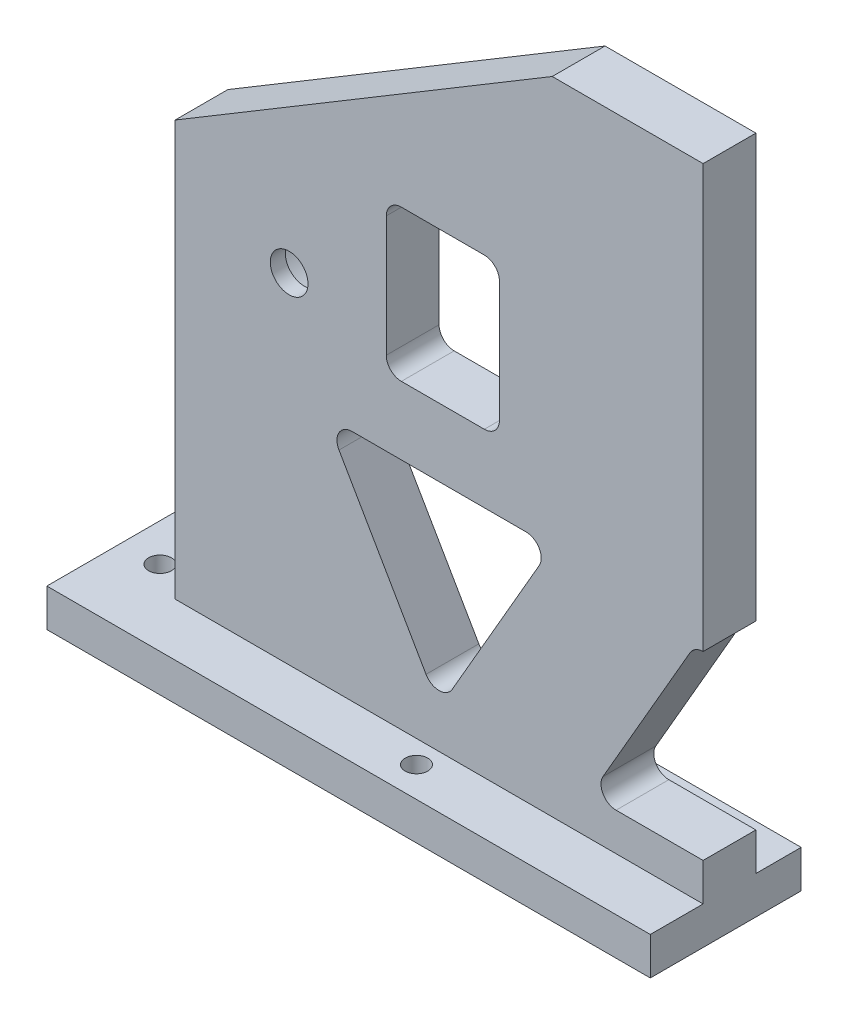
ISO-10303-21;
HEADER;
FILE_DESCRIPTION(('STEP AP214'),'2;1');
FILE_NAME('part.step','',(''),(''),'','','');
FILE_SCHEMA(('AUTOMOTIVE_DESIGN { 1 0 10303 214 1 1 1 1 }'));
ENDSEC;
DATA;
#1=APPLICATION_CONTEXT('core data for automotive mechanical design processes');
#2=APPLICATION_PROTOCOL_DEFINITION('international standard','automotive_design',2000,#1);
#3=PRODUCT_CONTEXT('',#1,'mechanical');
#4=PRODUCT('Part','Part','',(#3));
#5=PRODUCT_RELATED_PRODUCT_CATEGORY('part','',(#4));
#6=PRODUCT_DEFINITION_FORMATION('','',#4);
#7=PRODUCT_DEFINITION_CONTEXT('part definition',#1,'design');
#8=PRODUCT_DEFINITION('design','',#6,#7);
#9=PRODUCT_DEFINITION_SHAPE('','',#8);
#10=(LENGTH_UNIT() NAMED_UNIT(*) SI_UNIT(.MILLI.,.METRE.));
#11=(NAMED_UNIT(*) PLANE_ANGLE_UNIT() SI_UNIT($,.RADIAN.));
#12=(NAMED_UNIT(*) SI_UNIT($,.STERADIAN.) SOLID_ANGLE_UNIT());
#13=UNCERTAINTY_MEASURE_WITH_UNIT(LENGTH_MEASURE(1.E-05),#10,'distance_accuracy_value','');
#14=(GEOMETRIC_REPRESENTATION_CONTEXT(3) GLOBAL_UNCERTAINTY_ASSIGNED_CONTEXT((#13)) GLOBAL_UNIT_ASSIGNED_CONTEXT((#10,
#11,#12)) REPRESENTATION_CONTEXT('',''));
#15=CARTESIAN_POINT('',(0.,0.,0.));
#16=DIRECTION('',(0.,0.,1.));
#17=DIRECTION('',(1.,0.,0.));
#18=AXIS2_PLACEMENT_3D('',#15,#16,#17);
#19=CARTESIAN_POINT('',(70.,0.,0.));
#20=DIRECTION('',(-1.,0.,0.));
#21=DIRECTION('',(0.,-1.,0.));
#22=AXIS2_PLACEMENT_3D('',#19,#20,#21);
#23=PLANE('',#22);
#24=DIRECTION('',(0.,1.,0.));
#25=VECTOR('',#24,1.);
#26=CARTESIAN_POINT('',(70.,5.00000000000005,-6.00000000000002));
#27=LINE('',#26,#25);
#28=CARTESIAN_POINT('',(70.,0.,-6.00000000000002));
#29=VERTEX_POINT('',#28);
#30=CARTESIAN_POINT('',(70.,5.,-6.00000000000002));
#31=VERTEX_POINT('',#30);
#32=EDGE_CURVE('E11',#29,#31,#27,.T.);
#33=ORIENTED_EDGE('',*,*,#32,.T.);
#34=DIRECTION('',(0.,0.,-1.));
#35=VECTOR('',#34,1.);
#36=CARTESIAN_POINT('',(70.,5.,0.));
#37=LINE('',#36,#35);
#38=CARTESIAN_POINT('',(70.,5.,0.));
#39=VERTEX_POINT('',#38);
#40=EDGE_CURVE('E405',#39,#31,#37,.T.);
#41=ORIENTED_EDGE('',*,*,#40,.F.);
#42=DIRECTION('',(0.,-1.,0.));
#43=VECTOR('',#42,1.);
#44=CARTESIAN_POINT('',(70.,0.,0.));
#45=LINE('',#44,#43);
#46=CARTESIAN_POINT('',(70.,10.,0.));
#47=VERTEX_POINT('',#46);
#48=EDGE_CURVE('E398',#47,#39,#45,.T.);
#49=ORIENTED_EDGE('',*,*,#48,.F.);
#50=DIRECTION('',(0.,0.,-1.));
#51=VECTOR('',#50,1.);
#52=CARTESIAN_POINT('',(70.,10.,-6.00100000000002));
#53=LINE('',#52,#51);
#54=CARTESIAN_POINT('',(70.,10.,7.));
#55=VERTEX_POINT('',#54);
#56=EDGE_CURVE('E394',#55,#47,#53,.T.);
#57=ORIENTED_EDGE('',*,*,#56,.F.);
#58=DIRECTION('',(0.,-1.,0.));
#59=VECTOR('',#58,1.);
#60=CARTESIAN_POINT('',(70.,0.,7.));
#61=LINE('',#60,#59);
#62=CARTESIAN_POINT('',(70.,5.,7.));
#63=VERTEX_POINT('',#62);
#64=EDGE_CURVE('E399',#55,#63,#61,.T.);
#65=ORIENTED_EDGE('',*,*,#64,.T.);
#66=CARTESIAN_POINT('',(70.,5.,14.));
#67=VERTEX_POINT('',#66);
#68=EDGE_CURVE('E403',#67,#63,#37,.T.);
#69=ORIENTED_EDGE('',*,*,#68,.F.);
#70=DIRECTION('',(0.,-1.,0.));
#71=VECTOR('',#70,1.);
#72=CARTESIAN_POINT('',(70.,4.99999999999996,14.));
#73=LINE('',#72,#71);
#74=CARTESIAN_POINT('',(70.,0.,14.));
#75=VERTEX_POINT('',#74);
#76=EDGE_CURVE('E51',#67,#75,#73,.T.);
#77=ORIENTED_EDGE('',*,*,#76,.T.);
#78=DIRECTION('',(0.,0.,1.));
#79=VECTOR('',#78,1.);
#80=CARTESIAN_POINT('',(70.,0.,7.));
#81=LINE('',#80,#79);
#82=EDGE_CURVE('E46',#29,#75,#81,.T.);
#83=ORIENTED_EDGE('',*,*,#82,.F.);
#84=EDGE_LOOP('',(#33,#41,#49,#57,#65,#69,#77,#83));
#85=FACE_BOUND('',#84,.T.);
#86=ADVANCED_FACE('F43',(#85),#23,.F.);
#87=CARTESIAN_POINT('',(70.,90.,7.));
#88=VERTEX_POINT('',#87);
#89=CARTESIAN_POINT('',(70.,33.9807621135332,7.));
#90=VERTEX_POINT('',#89);
#91=EDGE_CURVE('E397',#88,#90,#61,.T.);
#92=ORIENTED_EDGE('',*,*,#91,.T.);
#93=DIRECTION('',(0.,0.,-1.));
#94=VECTOR('',#93,1.);
#95=CARTESIAN_POINT('',(70.,33.9807621135332,-6.00100000000002));
#96=LINE('',#95,#94);
#97=CARTESIAN_POINT('',(70.,33.9807621135332,0.));
#98=VERTEX_POINT('',#97);
#99=EDGE_CURVE('E392',#98,#90,#96,.F.);
#100=ORIENTED_EDGE('',*,*,#99,.F.);
#101=CARTESIAN_POINT('',(70.,90.,0.));
#102=VERTEX_POINT('',#101);
#103=EDGE_CURVE('E395',#102,#98,#45,.T.);
#104=ORIENTED_EDGE('',*,*,#103,.F.);
#105=DIRECTION('',(0.,0.,-1.));
#106=VECTOR('',#105,1.);
#107=CARTESIAN_POINT('',(70.,90.,7.));
#108=LINE('',#107,#106);
#109=EDGE_CURVE('E59',#88,#102,#108,.T.);
#110=ORIENTED_EDGE('',*,*,#109,.F.);
#111=EDGE_LOOP('',(#92,#100,#104,#110));
#112=FACE_BOUND('',#111,.T.);
#113=ADVANCED_FACE('F429',(#112),#23,.F.);
#114=CARTESIAN_POINT('',(15.1207990870121,49.999999999998,5.));
#115=DIRECTION('',(0.,0.,1.));
#116=DIRECTION('',(1.,0.,0.));
#117=AXIS2_PLACEMENT_3D('',#114,#115,#116);
#118=PLANE('',#117);
#119=CARTESIAN_POINT('',(15.1207990870121,49.999999999998,5.));
#120=DIRECTION('',(0.,0.,1.));
#121=DIRECTION('',(1.,0.,0.));
#122=AXIS2_PLACEMENT_3D('',#119,#120,#121);
#123=CIRCLE('',#122,7.);
#124=CARTESIAN_POINT('',(22.1207990870121,49.999999999998,5.));
#125=VERTEX_POINT('',#124);
#126=EDGE_CURVE('E274',#125,#125,#123,.T.);
#127=ORIENTED_EDGE('',*,*,#126,.F.);
#128=EDGE_LOOP('',(#127));
#129=FACE_BOUND('',#128,.T.);
#130=CARTESIAN_POINT('',(15.1207990870121,49.999999999998,5.));
#131=DIRECTION('',(0.,0.,1.));
#132=DIRECTION('',(1.,0.,0.));
#133=AXIS2_PLACEMENT_3D('',#130,#131,#132);
#134=CIRCLE('',#133,2.5);
#135=CARTESIAN_POINT('',(17.6207990870121,49.999999999998,5.));
#136=VERTEX_POINT('',#135);
#137=EDGE_CURVE('E273',#136,#136,#134,.F.);
#138=ORIENTED_EDGE('',*,*,#137,.F.);
#139=EDGE_LOOP('',(#138));
#140=FACE_BOUND('',#139,.T.);
#141=ADVANCED_FACE('F433',(#129,#140),#118,.F.);
#142=CARTESIAN_POINT('',(55.9129551957541,59.9999999999994,5.));
#143=DIRECTION('',(0.,0.,1.));
#144=DIRECTION('',(1.,0.,0.));
#145=AXIS2_PLACEMENT_3D('',#142,#143,#144);
#146=PLANE('',#145);
#147=CARTESIAN_POINT('',(55.9129551957541,59.9999999999994,5.));
#148=DIRECTION('',(0.,0.,1.));
#149=DIRECTION('',(1.,0.,0.));
#150=AXIS2_PLACEMENT_3D('',#147,#148,#149);
#151=CIRCLE('',#150,6.99999999999999);
#152=CARTESIAN_POINT('',(62.9129551957541,59.9999999999994,5.));
#153=VERTEX_POINT('',#152);
#154=EDGE_CURVE('E277',#153,#153,#151,.T.);
#155=ORIENTED_EDGE('',*,*,#154,.F.);
#156=EDGE_LOOP('',(#155));
#157=FACE_BOUND('',#156,.T.);
#158=ADVANCED_FACE('F438',(#157),#146,.F.);
#159=CARTESIAN_POINT('',(15.1207990870121,49.999999999998,0.));
#160=DIRECTION('',(0.,0.,-1.));
#161=DIRECTION('',(-1.,0.,0.));
#162=AXIS2_PLACEMENT_3D('',#159,#160,#161);
#163=CYLINDRICAL_SURFACE('',#162,2.5);
#164=ORIENTED_EDGE('',*,*,#137,.T.);
#165=EDGE_LOOP('',(#164));
#166=FACE_BOUND('',#165,.T.);
#167=CARTESIAN_POINT('',(15.1207990870121,49.999999999998,7.));
#168=DIRECTION('',(0.,0.,-1.));
#169=DIRECTION('',(-1.,0.,0.));
#170=AXIS2_PLACEMENT_3D('',#167,#168,#169);
#171=CIRCLE('',#170,2.5);
#172=CARTESIAN_POINT('',(12.6207990870121,49.999999999998,7.));
#173=VERTEX_POINT('',#172);
#174=EDGE_CURVE('E282',#173,#173,#171,.T.);
#175=ORIENTED_EDGE('',*,*,#174,.F.);
#176=EDGE_LOOP('',(#175));
#177=FACE_BOUND('',#176,.T.);
#178=ADVANCED_FACE('F665',(#166,#177),#163,.F.);
#179=CARTESIAN_POINT('',(15.1207990870121,49.999999999998,0.));
#180=DIRECTION('',(0.,0.,1.));
#181=DIRECTION('',(1.,0.,0.));
#182=AXIS2_PLACEMENT_3D('',#179,#180,#181);
#183=CYLINDRICAL_SURFACE('',#182,7.);
#184=CARTESIAN_POINT('',(15.1207990870121,49.999999999998,0.));
#185=DIRECTION('',(0.,0.,1.));
#186=DIRECTION('',(1.,0.,0.));
#187=AXIS2_PLACEMENT_3D('',#184,#185,#186);
#188=CIRCLE('',#187,7.);
#189=CARTESIAN_POINT('',(22.1207990870121,49.999999999998,0.));
#190=VERTEX_POINT('',#189);
#191=EDGE_CURVE('E270',#190,#190,#188,.T.);
#192=ORIENTED_EDGE('',*,*,#191,.F.);
#193=EDGE_LOOP('',(#192));
#194=FACE_BOUND('',#193,.T.);
#195=ORIENTED_EDGE('',*,*,#126,.T.);
#196=EDGE_LOOP('',(#195));
#197=FACE_BOUND('',#196,.T.);
#198=ADVANCED_FACE('F662',(#194,#197),#183,.F.);
#199=CARTESIAN_POINT('',(55.9129551957541,59.9999999999994,0.));
#200=DIRECTION('',(0.,0.,1.));
#201=DIRECTION('',(1.,0.,0.));
#202=AXIS2_PLACEMENT_3D('',#199,#200,#201);
#203=CYLINDRICAL_SURFACE('',#202,6.99999999999999);
#204=CARTESIAN_POINT('',(55.9129551957541,59.9999999999994,0.));
#205=DIRECTION('',(0.,0.,1.));
#206=DIRECTION('',(1.,0.,0.));
#207=AXIS2_PLACEMENT_3D('',#204,#205,#206);
#208=CIRCLE('',#207,6.99999999999999);
#209=CARTESIAN_POINT('',(62.9129551957541,59.9999999999994,0.));
#210=VERTEX_POINT('',#209);
#211=EDGE_CURVE('E269',#210,#210,#208,.T.);
#212=ORIENTED_EDGE('',*,*,#211,.F.);
#213=EDGE_LOOP('',(#212));
#214=FACE_BOUND('',#213,.T.);
#215=ORIENTED_EDGE('',*,*,#154,.T.);
#216=EDGE_LOOP('',(#215));
#217=FACE_BOUND('',#216,.T.);
#218=ADVANCED_FACE('F487',(#214,#217),#203,.F.);
#219=CARTESIAN_POINT('',(46.5358983848622,33.9807621135331,-6.00100000000002));
#220=DIRECTION('',(0.,0.,-1.));
#221=DIRECTION('',(-1.,0.,0.));
#222=AXIS2_PLACEMENT_3D('',#219,#220,#221);
#223=CYLINDRICAL_SURFACE('',#222,2.);
#224=CARTESIAN_POINT('',(46.5358983848622,33.9807621135331,0.));
#225=DIRECTION('',(0.,0.,1.));
#226=DIRECTION('',(1.,0.,0.));
#227=AXIS2_PLACEMENT_3D('',#224,#225,#226);
#228=CIRCLE('',#227,2.);
#229=CARTESIAN_POINT('',(48.2679491924311,32.9807621135331,0.));
#230=VERTEX_POINT('',#229);
#231=CARTESIAN_POINT('',(46.5358983848622,35.9807621135331,0.));
#232=VERTEX_POINT('',#231);
#233=EDGE_CURVE('E350',#230,#232,#228,.T.);
#234=ORIENTED_EDGE('',*,*,#233,.F.);
#235=DIRECTION('',(0.,0.,1.));
#236=VECTOR('',#235,1.);
#237=CARTESIAN_POINT('',(48.2679491924311,32.9807621135331,0.));
#238=LINE('',#237,#236);
#239=CARTESIAN_POINT('',(48.2679491924311,32.9807621135331,7.));
#240=VERTEX_POINT('',#239);
#241=EDGE_CURVE('E332',#240,#230,#238,.F.);
#242=ORIENTED_EDGE('',*,*,#241,.F.);
#243=CARTESIAN_POINT('',(46.5358983848622,33.9807621135331,7.));
#244=DIRECTION('',(0.,0.,1.));
#245=DIRECTION('',(1.,0.,0.));
#246=AXIS2_PLACEMENT_3D('',#243,#244,#245);
#247=CIRCLE('',#246,2.);
#248=CARTESIAN_POINT('',(46.5358983848622,35.9807621135331,7.));
#249=VERTEX_POINT('',#248);
#250=EDGE_CURVE('E348',#249,#240,#247,.F.);
#251=ORIENTED_EDGE('',*,*,#250,.F.);
#252=DIRECTION('',(0.,0.,1.));
#253=VECTOR('',#252,1.);
#254=CARTESIAN_POINT('',(46.5358983848622,35.9807621135331,7.));
#255=LINE('',#254,#253);
#256=EDGE_CURVE('E324',#232,#249,#255,.T.);
#257=ORIENTED_EDGE('',*,*,#256,.F.);
#258=EDGE_LOOP('',(#234,#242,#251,#257));
#259=FACE_BOUND('',#258,.T.);
#260=ADVANCED_FACE('F483',(#259),#223,.F.);
#261=CARTESIAN_POINT('',(50.,35.9807621135331,-6.00100000000002));
#262=DIRECTION('',(0.866025403784438,-0.5,0.));
#263=DIRECTION('',(0.5,0.866025403784439,0.));
#264=AXIS2_PLACEMENT_3D('',#261,#262,#263);
#265=PLANE('',#264);
#266=DIRECTION('',(0.5,0.866025403784438,0.));
#267=VECTOR('',#266,1.);
#268=CARTESIAN_POINT('',(50.,35.9807621135331,7.));
#269=LINE('',#268,#267);
#270=CARTESIAN_POINT('',(36.7320508075689,13.,7.));
#271=VERTEX_POINT('',#270);
#272=EDGE_CURVE('E554',#271,#240,#269,.T.);
#273=ORIENTED_EDGE('',*,*,#272,.T.);
#274=ORIENTED_EDGE('',*,*,#241,.T.);
#275=DIRECTION('',(-0.5,-0.866025403784439,0.));
#276=VECTOR('',#275,1.);
#277=CARTESIAN_POINT('',(50.,35.9807621135331,0.));
#278=LINE('',#277,#276);
#279=CARTESIAN_POINT('',(36.7320508075689,13.,0.));
#280=VERTEX_POINT('',#279);
#281=EDGE_CURVE('E548',#230,#280,#278,.T.);
#282=ORIENTED_EDGE('',*,*,#281,.T.);
#283=DIRECTION('',(0.,0.,1.));
#284=VECTOR('',#283,1.);
#285=CARTESIAN_POINT('',(36.7320508075689,13.,7.));
#286=LINE('',#285,#284);
#287=EDGE_CURVE('E329',#280,#271,#286,.T.);
#288=ORIENTED_EDGE('',*,*,#287,.T.);
#289=EDGE_LOOP('',(#273,#274,#282,#288));
#290=FACE_BOUND('',#289,.T.);
#291=ADVANCED_FACE('F486',(#290),#265,.F.);
#292=CARTESIAN_POINT('',(35.,14.,-6.00100000000002));
#293=DIRECTION('',(0.,0.,-1.));
#294=DIRECTION('',(-1.,0.,0.));
#295=AXIS2_PLACEMENT_3D('',#292,#293,#294);
#296=CYLINDRICAL_SURFACE('',#295,2.);
#297=CARTESIAN_POINT('',(35.,14.,0.));
#298=DIRECTION('',(0.,0.,1.));
#299=DIRECTION('',(1.,0.,0.));
#300=AXIS2_PLACEMENT_3D('',#297,#298,#299);
#301=CIRCLE('',#300,2.);
#302=CARTESIAN_POINT('',(33.2679491924311,13.,0.));
#303=VERTEX_POINT('',#302);
#304=EDGE_CURVE('E354',#303,#280,#301,.T.);
#305=ORIENTED_EDGE('',*,*,#304,.F.);
#306=DIRECTION('',(0.,0.,1.));
#307=VECTOR('',#306,1.);
#308=CARTESIAN_POINT('',(33.2679491924311,13.,0.));
#309=LINE('',#308,#307);
#310=CARTESIAN_POINT('',(33.2679491924311,13.,7.));
#311=VERTEX_POINT('',#310);
#312=EDGE_CURVE('E319',#311,#303,#309,.F.);
#313=ORIENTED_EDGE('',*,*,#312,.F.);
#314=CARTESIAN_POINT('',(35.,14.,7.));
#315=DIRECTION('',(0.,0.,1.));
#316=DIRECTION('',(1.,0.,0.));
#317=AXIS2_PLACEMENT_3D('',#314,#315,#316);
#318=CIRCLE('',#317,2.);
#319=EDGE_CURVE('E352',#271,#311,#318,.F.);
#320=ORIENTED_EDGE('',*,*,#319,.F.);
#321=ORIENTED_EDGE('',*,*,#287,.F.);
#322=EDGE_LOOP('',(#305,#313,#320,#321));
#323=FACE_BOUND('',#322,.T.);
#324=ADVANCED_FACE('F489',(#323),#296,.F.);
#325=CARTESIAN_POINT('',(35.,10.,-6.00100000000002));
#326=DIRECTION('',(-0.866025403784439,-0.5,0.));
#327=DIRECTION('',(0.5,-0.866025403784439,0.));
#328=AXIS2_PLACEMENT_3D('',#325,#326,#327);
#329=PLANE('',#328);
#330=DIRECTION('',(-0.5,0.866025403784439,0.));
#331=VECTOR('',#330,1.);
#332=CARTESIAN_POINT('',(35.,10.,0.));
#333=LINE('',#332,#331);
#334=CARTESIAN_POINT('',(21.7320508075689,32.9807621135332,0.));
#335=VERTEX_POINT('',#334);
#336=EDGE_CURVE('E560',#303,#335,#333,.T.);
#337=ORIENTED_EDGE('',*,*,#336,.T.);
#338=DIRECTION('',(0.,0.,1.));
#339=VECTOR('',#338,1.);
#340=CARTESIAN_POINT('',(21.7320508075689,32.9807621135332,7.));
#341=LINE('',#340,#339);
#342=CARTESIAN_POINT('',(21.7320508075689,32.9807621135332,7.));
#343=VERTEX_POINT('',#342);
#344=EDGE_CURVE('E321',#335,#343,#341,.T.);
#345=ORIENTED_EDGE('',*,*,#344,.T.);
#346=DIRECTION('',(0.5,-0.866025403784439,0.));
#347=VECTOR('',#346,1.);
#348=CARTESIAN_POINT('',(35.,10.,7.));
#349=LINE('',#348,#347);
#350=EDGE_CURVE('E557',#343,#311,#349,.T.);
#351=ORIENTED_EDGE('',*,*,#350,.T.);
#352=ORIENTED_EDGE('',*,*,#312,.T.);
#353=EDGE_LOOP('',(#337,#345,#351,#352));
#354=FACE_BOUND('',#353,.T.);
#355=ADVANCED_FACE('F481',(#354),#329,.F.);
#356=CARTESIAN_POINT('',(23.4641016151378,33.9807621135332,-6.00100000000002));
#357=DIRECTION('',(0.,0.,-1.));
#358=DIRECTION('',(-1.,0.,0.));
#359=AXIS2_PLACEMENT_3D('',#356,#357,#358);
#360=CYLINDRICAL_SURFACE('',#359,2.);
#361=CARTESIAN_POINT('',(23.4641016151378,33.9807621135332,0.));
#362=DIRECTION('',(0.,0.,1.));
#363=DIRECTION('',(1.,0.,0.));
#364=AXIS2_PLACEMENT_3D('',#361,#362,#363);
#365=CIRCLE('',#364,2.);
#366=CARTESIAN_POINT('',(23.4641016151378,35.9807621135332,0.));
#367=VERTEX_POINT('',#366);
#368=EDGE_CURVE('E346',#367,#335,#365,.T.);
#369=ORIENTED_EDGE('',*,*,#368,.F.);
#370=DIRECTION('',(0.,0.,1.));
#371=VECTOR('',#370,1.);
#372=CARTESIAN_POINT('',(23.4641016151378,35.9807621135332,0.));
#373=LINE('',#372,#371);
#374=CARTESIAN_POINT('',(23.4641016151378,35.9807621135332,7.));
#375=VERTEX_POINT('',#374);
#376=EDGE_CURVE('E327',#375,#367,#373,.F.);
#377=ORIENTED_EDGE('',*,*,#376,.F.);
#378=CARTESIAN_POINT('',(23.4641016151378,33.9807621135332,7.));
#379=DIRECTION('',(0.,0.,1.));
#380=DIRECTION('',(1.,0.,0.));
#381=AXIS2_PLACEMENT_3D('',#378,#379,#380);
#382=CIRCLE('',#381,2.);
#383=EDGE_CURVE('E344',#343,#375,#382,.F.);
#384=ORIENTED_EDGE('',*,*,#383,.F.);
#385=ORIENTED_EDGE('',*,*,#344,.F.);
#386=EDGE_LOOP('',(#369,#377,#384,#385));
#387=FACE_BOUND('',#386,.T.);
#388=ADVANCED_FACE('F477',(#387),#360,.F.);
#389=CARTESIAN_POINT('',(20.,35.9807621135332,-6.00100000000002));
#390=DIRECTION('',(0.,1.,0.));
#391=DIRECTION('',(-1.,0.,0.));
#392=AXIS2_PLACEMENT_3D('',#389,#390,#391);
#393=PLANE('',#392);
#394=DIRECTION('',(-1.,0.,0.));
#395=VECTOR('',#394,1.);
#396=CARTESIAN_POINT('',(20.,35.9807621135332,7.));
#397=LINE('',#396,#395);
#398=EDGE_CURVE('E551',#249,#375,#397,.T.);
#399=ORIENTED_EDGE('',*,*,#398,.T.);
#400=ORIENTED_EDGE('',*,*,#376,.T.);
#401=DIRECTION('',(1.,0.,0.));
#402=VECTOR('',#401,1.);
#403=CARTESIAN_POINT('',(20.,35.9807621135332,0.));
#404=LINE('',#403,#402);
#405=EDGE_CURVE('E563',#367,#232,#404,.T.);
#406=ORIENTED_EDGE('',*,*,#405,.T.);
#407=ORIENTED_EDGE('',*,*,#256,.T.);
#408=EDGE_LOOP('',(#399,#400,#406,#407));
#409=FACE_BOUND('',#408,.T.);
#410=ADVANCED_FACE('F480',(#409),#393,.F.);
#411=CARTESIAN_POINT('',(30.,47.,14.));
#412=DIRECTION('',(0.,0.,1.));
#413=DIRECTION('',(1.,0.,0.));
#414=AXIS2_PLACEMENT_3D('',#411,#412,#413);
#415=CYLINDRICAL_SURFACE('',#414,2.);
#416=CARTESIAN_POINT('',(30.,47.,7.));
#417=DIRECTION('',(0.,0.,1.));
#418=DIRECTION('',(1.,0.,0.));
#419=AXIS2_PLACEMENT_3D('',#416,#417,#418);
#420=CIRCLE('',#419,2.);
#421=CARTESIAN_POINT('',(30.,45.,7.));
#422=VERTEX_POINT('',#421);
#423=CARTESIAN_POINT('',(28.,47.,7.));
#424=VERTEX_POINT('',#423);
#425=EDGE_CURVE('E386',#422,#424,#420,.F.);
#426=ORIENTED_EDGE('',*,*,#425,.F.);
#427=DIRECTION('',(0.,0.,-1.));
#428=VECTOR('',#427,1.);
#429=CARTESIAN_POINT('',(30.,45.,7.));
#430=LINE('',#429,#428);
#431=CARTESIAN_POINT('',(30.,45.,0.));
#432=VERTEX_POINT('',#431);
#433=EDGE_CURVE('E374',#432,#422,#430,.F.);
#434=ORIENTED_EDGE('',*,*,#433,.F.);
#435=CARTESIAN_POINT('',(30.,47.,0.));
#436=DIRECTION('',(0.,0.,1.));
#437=DIRECTION('',(1.,0.,0.));
#438=AXIS2_PLACEMENT_3D('',#435,#436,#437);
#439=CIRCLE('',#438,2.);
#440=CARTESIAN_POINT('',(28.,47.,0.));
#441=VERTEX_POINT('',#440);
#442=EDGE_CURVE('E384',#441,#432,#439,.T.);
#443=ORIENTED_EDGE('',*,*,#442,.F.);
#444=DIRECTION('',(0.,0.,-1.));
#445=VECTOR('',#444,1.);
#446=CARTESIAN_POINT('',(28.,47.,0.));
#447=LINE('',#446,#445);
#448=EDGE_CURVE('E366',#424,#441,#447,.T.);
#449=ORIENTED_EDGE('',*,*,#448,.F.);
#450=EDGE_LOOP('',(#426,#434,#443,#449));
#451=FACE_BOUND('',#450,.T.);
#452=ADVANCED_FACE('F504',(#451),#415,.F.);
#453=CARTESIAN_POINT('',(28.,65.,14.));
#454=DIRECTION('',(-1.,0.,0.));
#455=DIRECTION('',(0.,-1.,0.));
#456=AXIS2_PLACEMENT_3D('',#453,#454,#455);
#457=PLANE('',#456);
#458=DIRECTION('',(0.,1.,0.));
#459=VECTOR('',#458,1.);
#460=CARTESIAN_POINT('',(28.,65.,0.));
#461=LINE('',#460,#459);
#462=CARTESIAN_POINT('',(28.,63.,0.));
#463=VERTEX_POINT('',#462);
#464=EDGE_CURVE('E634',#441,#463,#461,.T.);
#465=ORIENTED_EDGE('',*,*,#464,.T.);
#466=DIRECTION('',(0.,0.,-1.));
#467=VECTOR('',#466,1.);
#468=CARTESIAN_POINT('',(28.,63.,7.));
#469=LINE('',#468,#467);
#470=CARTESIAN_POINT('',(28.,63.,7.));
#471=VERTEX_POINT('',#470);
#472=EDGE_CURVE('E369',#463,#471,#469,.F.);
#473=ORIENTED_EDGE('',*,*,#472,.T.);
#474=DIRECTION('',(0.,-1.,0.));
#475=VECTOR('',#474,1.);
#476=CARTESIAN_POINT('',(28.,0.,7.));
#477=LINE('',#476,#475);
#478=EDGE_CURVE('E534',#471,#424,#477,.T.);
#479=ORIENTED_EDGE('',*,*,#478,.T.);
#480=ORIENTED_EDGE('',*,*,#448,.T.);
#481=EDGE_LOOP('',(#465,#473,#479,#480));
#482=FACE_BOUND('',#481,.T.);
#483=ADVANCED_FACE('F502',(#482),#457,.F.);
#484=CARTESIAN_POINT('',(30.,63.,14.));
#485=DIRECTION('',(0.,0.,1.));
#486=DIRECTION('',(1.,0.,0.));
#487=AXIS2_PLACEMENT_3D('',#484,#485,#486);
#488=CYLINDRICAL_SURFACE('',#487,2.);
#489=CARTESIAN_POINT('',(30.,63.,7.));
#490=DIRECTION('',(0.,0.,1.));
#491=DIRECTION('',(1.,0.,0.));
#492=AXIS2_PLACEMENT_3D('',#489,#490,#491);
#493=CIRCLE('',#492,2.);
#494=CARTESIAN_POINT('',(30.,65.,7.));
#495=VERTEX_POINT('',#494);
#496=EDGE_CURVE('E382',#471,#495,#493,.F.);
#497=ORIENTED_EDGE('',*,*,#496,.F.);
#498=ORIENTED_EDGE('',*,*,#472,.F.);
#499=CARTESIAN_POINT('',(30.,63.,0.));
#500=DIRECTION('',(0.,0.,1.));
#501=DIRECTION('',(1.,0.,0.));
#502=AXIS2_PLACEMENT_3D('',#499,#500,#501);
#503=CIRCLE('',#502,2.);
#504=CARTESIAN_POINT('',(30.,65.,0.));
#505=VERTEX_POINT('',#504);
#506=EDGE_CURVE('E380',#505,#463,#503,.T.);
#507=ORIENTED_EDGE('',*,*,#506,.F.);
#508=DIRECTION('',(0.,0.,-1.));
#509=VECTOR('',#508,1.);
#510=CARTESIAN_POINT('',(30.,65.,0.));
#511=LINE('',#510,#509);
#512=EDGE_CURVE('E361',#495,#505,#511,.T.);
#513=ORIENTED_EDGE('',*,*,#512,.F.);
#514=EDGE_LOOP('',(#497,#498,#507,#513));
#515=FACE_BOUND('',#514,.T.);
#516=ADVANCED_FACE('F499',(#515),#488,.F.);
#517=CARTESIAN_POINT('',(43.,65.,14.));
#518=DIRECTION('',(0.,1.,0.));
#519=DIRECTION('',(0.,0.,1.));
#520=AXIS2_PLACEMENT_3D('',#517,#518,#519);
#521=PLANE('',#520);
#522=DIRECTION('',(1.,0.,0.));
#523=VECTOR('',#522,1.);
#524=CARTESIAN_POINT('',(43.,65.,0.));
#525=LINE('',#524,#523);
#526=CARTESIAN_POINT('',(41.,65.,0.));
#527=VERTEX_POINT('',#526);
#528=EDGE_CURVE('E639',#505,#527,#525,.T.);
#529=ORIENTED_EDGE('',*,*,#528,.T.);
#530=DIRECTION('',(0.,0.,-1.));
#531=VECTOR('',#530,1.);
#532=CARTESIAN_POINT('',(41.,65.,7.));
#533=LINE('',#532,#531);
#534=CARTESIAN_POINT('',(41.,65.,7.));
#535=VERTEX_POINT('',#534);
#536=EDGE_CURVE('E364',#527,#535,#533,.F.);
#537=ORIENTED_EDGE('',*,*,#536,.T.);
#538=DIRECTION('',(-1.,0.,0.));
#539=VECTOR('',#538,1.);
#540=CARTESIAN_POINT('',(0.,65.,7.));
#541=LINE('',#540,#539);
#542=EDGE_CURVE('E538',#535,#495,#541,.T.);
#543=ORIENTED_EDGE('',*,*,#542,.T.);
#544=ORIENTED_EDGE('',*,*,#512,.T.);
#545=EDGE_LOOP('',(#529,#537,#543,#544));
#546=FACE_BOUND('',#545,.T.);
#547=ADVANCED_FACE('F497',(#546),#521,.F.);
#548=CARTESIAN_POINT('',(41.,63.,14.));
#549=DIRECTION('',(0.,0.,1.));
#550=DIRECTION('',(1.,0.,0.));
#551=AXIS2_PLACEMENT_3D('',#548,#549,#550);
#552=CYLINDRICAL_SURFACE('',#551,2.);
#553=CARTESIAN_POINT('',(41.,63.,7.));
#554=DIRECTION('',(0.,0.,1.));
#555=DIRECTION('',(1.,0.,0.));
#556=AXIS2_PLACEMENT_3D('',#553,#554,#555);
#557=CIRCLE('',#556,2.);
#558=CARTESIAN_POINT('',(43.,63.,7.));
#559=VERTEX_POINT('',#558);
#560=EDGE_CURVE('E378',#535,#559,#557,.F.);
#561=ORIENTED_EDGE('',*,*,#560,.F.);
#562=ORIENTED_EDGE('',*,*,#536,.F.);
#563=CARTESIAN_POINT('',(41.,63.,0.));
#564=DIRECTION('',(0.,0.,1.));
#565=DIRECTION('',(1.,0.,0.));
#566=AXIS2_PLACEMENT_3D('',#563,#564,#565);
#567=CIRCLE('',#566,2.);
#568=CARTESIAN_POINT('',(43.,63.,0.));
#569=VERTEX_POINT('',#568);
#570=EDGE_CURVE('E376',#569,#527,#567,.T.);
#571=ORIENTED_EDGE('',*,*,#570,.F.);
#572=DIRECTION('',(0.,0.,-1.));
#573=VECTOR('',#572,1.);
#574=CARTESIAN_POINT('',(43.,63.,0.));
#575=LINE('',#574,#573);
#576=EDGE_CURVE('E358',#559,#569,#575,.T.);
#577=ORIENTED_EDGE('',*,*,#576,.F.);
#578=EDGE_LOOP('',(#561,#562,#571,#577));
#579=FACE_BOUND('',#578,.T.);
#580=ADVANCED_FACE('F493',(#579),#552,.F.);
#581=CARTESIAN_POINT('',(43.,65.,14.));
#582=DIRECTION('',(1.,0.,0.));
#583=DIRECTION('',(0.,0.,-1.));
#584=AXIS2_PLACEMENT_3D('',#581,#582,#583);
#585=PLANE('',#584);
#586=DIRECTION('',(0.,1.,0.));
#587=VECTOR('',#586,1.);
#588=CARTESIAN_POINT('',(43.,0.,7.));
#589=LINE('',#588,#587);
#590=CARTESIAN_POINT('',(43.,47.,7.));
#591=VERTEX_POINT('',#590);
#592=EDGE_CURVE('E530',#591,#559,#589,.T.);
#593=ORIENTED_EDGE('',*,*,#592,.T.);
#594=ORIENTED_EDGE('',*,*,#576,.T.);
#595=DIRECTION('',(0.,-1.,0.));
#596=VECTOR('',#595,1.);
#597=CARTESIAN_POINT('',(43.,65.,0.));
#598=LINE('',#597,#596);
#599=CARTESIAN_POINT('',(43.,47.,0.));
#600=VERTEX_POINT('',#599);
#601=EDGE_CURVE('E535',#569,#600,#598,.T.);
#602=ORIENTED_EDGE('',*,*,#601,.T.);
#603=DIRECTION('',(0.,0.,-1.));
#604=VECTOR('',#603,1.);
#605=CARTESIAN_POINT('',(43.,47.,7.));
#606=LINE('',#605,#604);
#607=EDGE_CURVE('E356',#600,#591,#606,.F.);
#608=ORIENTED_EDGE('',*,*,#607,.T.);
#609=EDGE_LOOP('',(#593,#594,#602,#608));
#610=FACE_BOUND('',#609,.T.);
#611=ADVANCED_FACE('F496',(#610),#585,.F.);
#612=CARTESIAN_POINT('',(41.,47.,14.));
#613=DIRECTION('',(0.,0.,1.));
#614=DIRECTION('',(1.,0.,0.));
#615=AXIS2_PLACEMENT_3D('',#612,#613,#614);
#616=CYLINDRICAL_SURFACE('',#615,2.);
#617=CARTESIAN_POINT('',(41.,47.,7.));
#618=DIRECTION('',(0.,0.,1.));
#619=DIRECTION('',(1.,0.,0.));
#620=AXIS2_PLACEMENT_3D('',#617,#618,#619);
#621=CIRCLE('',#620,2.);
#622=CARTESIAN_POINT('',(41.,45.,7.));
#623=VERTEX_POINT('',#622);
#624=EDGE_CURVE('E390',#591,#623,#621,.F.);
#625=ORIENTED_EDGE('',*,*,#624,.F.);
#626=ORIENTED_EDGE('',*,*,#607,.F.);
#627=CARTESIAN_POINT('',(41.,47.,0.));
#628=DIRECTION('',(0.,0.,1.));
#629=DIRECTION('',(1.,0.,0.));
#630=AXIS2_PLACEMENT_3D('',#627,#628,#629);
#631=CIRCLE('',#630,2.);
#632=CARTESIAN_POINT('',(41.,45.,0.));
#633=VERTEX_POINT('',#632);
#634=EDGE_CURVE('E388',#633,#600,#631,.T.);
#635=ORIENTED_EDGE('',*,*,#634,.F.);
#636=DIRECTION('',(0.,0.,-1.));
#637=VECTOR('',#636,1.);
#638=CARTESIAN_POINT('',(41.,45.,0.));
#639=LINE('',#638,#637);
#640=EDGE_CURVE('E371',#623,#633,#639,.T.);
#641=ORIENTED_EDGE('',*,*,#640,.F.);
#642=EDGE_LOOP('',(#625,#626,#635,#641));
#643=FACE_BOUND('',#642,.T.);
#644=ADVANCED_FACE('F507',(#643),#616,.F.);
#645=CARTESIAN_POINT('',(43.,45.,14.));
#646=DIRECTION('',(0.,-1.,0.));
#647=DIRECTION('',(0.,0.,-1.));
#648=AXIS2_PLACEMENT_3D('',#645,#646,#647);
#649=PLANE('',#648);
#650=DIRECTION('',(-1.,0.,0.));
#651=VECTOR('',#650,1.);
#652=CARTESIAN_POINT('',(43.,45.,0.));
#653=LINE('',#652,#651);
#654=EDGE_CURVE('E541',#633,#432,#653,.T.);
#655=ORIENTED_EDGE('',*,*,#654,.T.);
#656=ORIENTED_EDGE('',*,*,#433,.T.);
#657=DIRECTION('',(1.,0.,0.));
#658=VECTOR('',#657,1.);
#659=CARTESIAN_POINT('',(0.,45.,7.));
#660=LINE('',#659,#658);
#661=EDGE_CURVE('E527',#422,#623,#660,.T.);
#662=ORIENTED_EDGE('',*,*,#661,.T.);
#663=ORIENTED_EDGE('',*,*,#640,.T.);
#664=EDGE_LOOP('',(#655,#656,#662,#663));
#665=FACE_BOUND('',#664,.T.);
#666=ADVANCED_FACE('F466',(#665),#649,.F.);
#667=CARTESIAN_POINT('',(0.,59.9999999999999,7.));
#668=DIRECTION('',(0.514495755427525,-0.857492925712545,0.));
#669=DIRECTION('',(0.,0.,-1.));
#670=AXIS2_PLACEMENT_3D('',#667,#668,#669);
#671=PLANE('',#670);
#672=DIRECTION('',(0.857492925712545,0.514495755427525,0.));
#673=VECTOR('',#672,1.);
#674=CARTESIAN_POINT('',(-26.4705882352941,44.1176470588236,7.));
#675=LINE('',#674,#673);
#676=CARTESIAN_POINT('',(50.0000000000003,90.,7.));
#677=VERTEX_POINT('',#676);
#678=CARTESIAN_POINT('',(0.,59.9999999999999,7.));
#679=VERTEX_POINT('',#678);
#680=EDGE_CURVE('E306',#677,#679,#675,.F.);
#681=ORIENTED_EDGE('',*,*,#680,.F.);
#682=DIRECTION('',(0.,0.,1.));
#683=VECTOR('',#682,1.);
#684=CARTESIAN_POINT('',(50.0000000000003,90.,7.));
#685=LINE('',#684,#683);
#686=CARTESIAN_POINT('',(50.0000000000003,90.,0.));
#687=VERTEX_POINT('',#686);
#688=EDGE_CURVE('E303',#687,#677,#685,.T.);
#689=ORIENTED_EDGE('',*,*,#688,.F.);
#690=DIRECTION('',(-0.857492925712545,-0.514495755427525,0.));
#691=VECTOR('',#690,1.);
#692=CARTESIAN_POINT('',(0.,59.9999999999999,0.));
#693=LINE('',#692,#691);
#694=CARTESIAN_POINT('',(0.,59.9999999999999,0.));
#695=VERTEX_POINT('',#694);
#696=EDGE_CURVE('E300',#695,#687,#693,.F.);
#697=ORIENTED_EDGE('',*,*,#696,.F.);
#698=DIRECTION('',(0.,0.,-1.));
#699=VECTOR('',#698,1.);
#700=CARTESIAN_POINT('',(0.,59.9999999999999,7.));
#701=LINE('',#700,#699);
#702=EDGE_CURVE('E292',#679,#695,#701,.T.);
#703=ORIENTED_EDGE('',*,*,#702,.F.);
#704=EDGE_LOOP('',(#681,#689,#697,#703));
#705=FACE_BOUND('',#704,.T.);
#706=ADVANCED_FACE('F459',(#705),#671,.F.);
#707=CARTESIAN_POINT('',(0.,0.,7.));
#708=DIRECTION('',(1.,0.,0.));
#709=DIRECTION('',(0.,0.,-1.));
#710=AXIS2_PLACEMENT_3D('',#707,#708,#709);
#711=PLANE('',#710);
#712=DIRECTION('',(0.,0.,-1.));
#713=VECTOR('',#712,1.);
#714=CARTESIAN_POINT('',(0.,5.,7.));
#715=LINE('',#714,#713);
#716=CARTESIAN_POINT('',(0.,5.,7.));
#717=VERTEX_POINT('',#716);
#718=CARTESIAN_POINT('',(0.,5.,0.));
#719=VERTEX_POINT('',#718);
#720=EDGE_CURVE('E262',#717,#719,#715,.T.);
#721=ORIENTED_EDGE('',*,*,#720,.F.);
#722=DIRECTION('',(0.,-1.,0.));
#723=VECTOR('',#722,1.);
#724=CARTESIAN_POINT('',(0.,0.,7.));
#725=LINE('',#724,#723);
#726=EDGE_CURVE('E286',#679,#717,#725,.T.);
#727=ORIENTED_EDGE('',*,*,#726,.F.);
#728=ORIENTED_EDGE('',*,*,#702,.T.);
#729=DIRECTION('',(0.,-1.,0.));
#730=VECTOR('',#729,1.);
#731=CARTESIAN_POINT('',(0.,0.,0.));
#732=LINE('',#731,#730);
#733=EDGE_CURVE('E285',#695,#719,#732,.T.);
#734=ORIENTED_EDGE('',*,*,#733,.T.);
#735=EDGE_LOOP('',(#721,#727,#728,#734));
#736=FACE_BOUND('',#735,.T.);
#737=ADVANCED_FACE('F455',(#736),#711,.F.);
#738=CARTESIAN_POINT('',(58.4641016151378,12.,-6.00100000000002));
#739=DIRECTION('',(0.,0.,-1.));
#740=DIRECTION('',(-1.,0.,0.));
#741=AXIS2_PLACEMENT_3D('',#738,#739,#740);
#742=CYLINDRICAL_SURFACE('',#741,2.);
#743=CARTESIAN_POINT('',(58.4641016151378,12.,0.));
#744=DIRECTION('',(0.,0.,1.));
#745=DIRECTION('',(1.,0.,0.));
#746=AXIS2_PLACEMENT_3D('',#743,#744,#745);
#747=CIRCLE('',#746,2.);
#748=CARTESIAN_POINT('',(56.7320508075689,13.,0.));
#749=VERTEX_POINT('',#748);
#750=CARTESIAN_POINT('',(58.4641016151378,10.,0.));
#751=VERTEX_POINT('',#750);
#752=EDGE_CURVE('E341',#749,#751,#747,.T.);
#753=ORIENTED_EDGE('',*,*,#752,.F.);
#754=DIRECTION('',(0.,0.,1.));
#755=VECTOR('',#754,1.);
#756=CARTESIAN_POINT('',(56.7320508075689,13.,0.));
#757=LINE('',#756,#755);
#758=CARTESIAN_POINT('',(56.7320508075689,13.,7.));
#759=VERTEX_POINT('',#758);
#760=EDGE_CURVE('E311',#759,#749,#757,.F.);
#761=ORIENTED_EDGE('',*,*,#760,.F.);
#762=CARTESIAN_POINT('',(58.4641016151378,12.,7.));
#763=DIRECTION('',(0.,0.,1.));
#764=DIRECTION('',(1.,0.,0.));
#765=AXIS2_PLACEMENT_3D('',#762,#763,#764);
#766=CIRCLE('',#765,2.);
#767=CARTESIAN_POINT('',(58.4641016151378,10.,7.));
#768=VERTEX_POINT('',#767);
#769=EDGE_CURVE('E339',#768,#759,#766,.F.);
#770=ORIENTED_EDGE('',*,*,#769,.F.);
#771=DIRECTION('',(0.,0.,1.));
#772=VECTOR('',#771,1.);
#773=CARTESIAN_POINT('',(58.4641016151378,10.,7.));
#774=LINE('',#773,#772);
#775=EDGE_CURVE('E316',#751,#768,#774,.T.);
#776=ORIENTED_EDGE('',*,*,#775,.F.);
#777=EDGE_LOOP('',(#753,#761,#770,#776));
#778=FACE_BOUND('',#777,.T.);
#779=ADVANCED_FACE('F458',(#778),#742,.F.);
#780=CARTESIAN_POINT('',(70.,35.9807621135332,-6.00100000000002));
#781=DIRECTION('',(-0.866025403784439,0.5,0.));
#782=DIRECTION('',(-0.5,-0.866025403784439,0.));
#783=AXIS2_PLACEMENT_3D('',#780,#781,#782);
#784=PLANE('',#783);
#785=DIRECTION('',(0.5,0.866025403784439,0.));
#786=VECTOR('',#785,1.);
#787=CARTESIAN_POINT('',(70.,35.9807621135332,0.));
#788=LINE('',#787,#786);
#789=CARTESIAN_POINT('',(68.2679491924311,32.9807621135332,0.));
#790=VERTEX_POINT('',#789);
#791=EDGE_CURVE('E566',#749,#790,#788,.T.);
#792=ORIENTED_EDGE('',*,*,#791,.T.);
#793=DIRECTION('',(0.,0.,1.));
#794=VECTOR('',#793,1.);
#795=CARTESIAN_POINT('',(68.2679491924311,32.9807621135332,7.));
#796=LINE('',#795,#794);
#797=CARTESIAN_POINT('',(68.2679491924311,32.9807621135332,7.));
#798=VERTEX_POINT('',#797);
#799=EDGE_CURVE('E313',#790,#798,#796,.T.);
#800=ORIENTED_EDGE('',*,*,#799,.T.);
#801=DIRECTION('',(-0.5,-0.866025403784439,0.));
#802=VECTOR('',#801,1.);
#803=CARTESIAN_POINT('',(70.,35.9807621135332,7.));
#804=LINE('',#803,#802);
#805=EDGE_CURVE('E569',#798,#759,#804,.T.);
#806=ORIENTED_EDGE('',*,*,#805,.T.);
#807=ORIENTED_EDGE('',*,*,#760,.T.);
#808=EDGE_LOOP('',(#792,#800,#806,#807));
#809=FACE_BOUND('',#808,.T.);
#810=ADVANCED_FACE('F475',(#809),#784,.F.);
#811=CARTESIAN_POINT('',(0.,0.,7.));
#812=DIRECTION('',(0.,0.,1.));
#813=DIRECTION('',(1.,0.,0.));
#814=AXIS2_PLACEMENT_3D('',#811,#812,#813);
#815=PLANE('',#814);
#816=ORIENTED_EDGE('',*,*,#91,.F.);
#817=DIRECTION('',(-1.,0.,0.));
#818=VECTOR('',#817,1.);
#819=CARTESIAN_POINT('',(130.,90.,7.));
#820=LINE('',#819,#818);
#821=EDGE_CURVE('E289',#88,#677,#820,.T.);
#822=ORIENTED_EDGE('',*,*,#821,.T.);
#823=ORIENTED_EDGE('',*,*,#680,.T.);
#824=ORIENTED_EDGE('',*,*,#726,.T.);
#825=DIRECTION('',(1.,0.,0.));
#826=VECTOR('',#825,1.);
#827=CARTESIAN_POINT('',(0.,5.,7.));
#828=LINE('',#827,#826);
#829=EDGE_CURVE('E266',#717,#63,#828,.T.);
#830=ORIENTED_EDGE('',*,*,#829,.T.);
#831=ORIENTED_EDGE('',*,*,#64,.F.);
#832=DIRECTION('',(1.,0.,0.));
#833=VECTOR('',#832,1.);
#834=CARTESIAN_POINT('',(55.,10.,7.));
#835=LINE('',#834,#833);
#836=EDGE_CURVE('E572',#768,#55,#835,.T.);
#837=ORIENTED_EDGE('',*,*,#836,.F.);
#838=ORIENTED_EDGE('',*,*,#769,.T.);
#839=ORIENTED_EDGE('',*,*,#805,.F.);
#840=CARTESIAN_POINT('',(70.,31.9807621135332,7.));
#841=DIRECTION('',(0.,0.,1.));
#842=DIRECTION('',(1.,0.,0.));
#843=AXIS2_PLACEMENT_3D('',#840,#841,#842);
#844=CIRCLE('',#843,2.);
#845=EDGE_CURVE('E334',#798,#90,#844,.F.);
#846=ORIENTED_EDGE('',*,*,#845,.T.);
#847=EDGE_LOOP('',(#816,#822,#823,#824,#830,#831,#837,#838,#839,#846));
#848=FACE_BOUND('',#847,.T.);
#849=ORIENTED_EDGE('',*,*,#592,.F.);
#850=ORIENTED_EDGE('',*,*,#624,.T.);
#851=ORIENTED_EDGE('',*,*,#661,.F.);
#852=ORIENTED_EDGE('',*,*,#425,.T.);
#853=ORIENTED_EDGE('',*,*,#478,.F.);
#854=ORIENTED_EDGE('',*,*,#496,.T.);
#855=ORIENTED_EDGE('',*,*,#542,.F.);
#856=ORIENTED_EDGE('',*,*,#560,.T.);
#857=EDGE_LOOP('',(#849,#850,#851,#852,#853,#854,#855,#856));
#858=FACE_BOUND('',#857,.T.);
#859=ORIENTED_EDGE('',*,*,#350,.F.);
#860=ORIENTED_EDGE('',*,*,#383,.T.);
#861=ORIENTED_EDGE('',*,*,#398,.F.);
#862=ORIENTED_EDGE('',*,*,#250,.T.);
#863=ORIENTED_EDGE('',*,*,#272,.F.);
#864=ORIENTED_EDGE('',*,*,#319,.T.);
#865=EDGE_LOOP('',(#859,#860,#861,#862,#863,#864));
#866=FACE_BOUND('',#865,.T.);
#867=ORIENTED_EDGE('',*,*,#174,.T.);
#868=EDGE_LOOP('',(#867));
#869=FACE_BOUND('',#868,.T.);
#870=ADVANCED_FACE('F525',(#848,#858,#866,#869),#815,.T.);
#871=CARTESIAN_POINT('',(0.,0.,0.));
#872=DIRECTION('',(0.,0.,1.));
#873=DIRECTION('',(1.,0.,0.));
#874=AXIS2_PLACEMENT_3D('',#871,#872,#873);
#875=PLANE('',#874);
#876=ORIENTED_EDGE('',*,*,#654,.F.);
#877=ORIENTED_EDGE('',*,*,#634,.T.);
#878=ORIENTED_EDGE('',*,*,#601,.F.);
#879=ORIENTED_EDGE('',*,*,#570,.T.);
#880=ORIENTED_EDGE('',*,*,#528,.F.);
#881=ORIENTED_EDGE('',*,*,#506,.T.);
#882=ORIENTED_EDGE('',*,*,#464,.F.);
#883=ORIENTED_EDGE('',*,*,#442,.T.);
#884=EDGE_LOOP('',(#876,#877,#878,#879,#880,#881,#882,#883));
#885=FACE_BOUND('',#884,.T.);
#886=ORIENTED_EDGE('',*,*,#405,.F.);
#887=ORIENTED_EDGE('',*,*,#368,.T.);
#888=ORIENTED_EDGE('',*,*,#336,.F.);
#889=ORIENTED_EDGE('',*,*,#304,.T.);
#890=ORIENTED_EDGE('',*,*,#281,.F.);
#891=ORIENTED_EDGE('',*,*,#233,.T.);
#892=EDGE_LOOP('',(#886,#887,#888,#889,#890,#891));
#893=FACE_BOUND('',#892,.T.);
#894=DIRECTION('',(-1.,0.,0.));
#895=VECTOR('',#894,1.);
#896=CARTESIAN_POINT('',(130.,90.,0.));
#897=LINE('',#896,#895);
#898=EDGE_CURVE('E290',#102,#687,#897,.T.);
#899=ORIENTED_EDGE('',*,*,#898,.F.);
#900=ORIENTED_EDGE('',*,*,#103,.T.);
#901=CARTESIAN_POINT('',(70.,31.9807621135332,0.));
#902=DIRECTION('',(0.,0.,1.));
#903=DIRECTION('',(1.,0.,0.));
#904=AXIS2_PLACEMENT_3D('',#901,#902,#903);
#905=CIRCLE('',#904,2.);
#906=EDGE_CURVE('E337',#98,#790,#905,.T.);
#907=ORIENTED_EDGE('',*,*,#906,.T.);
#908=ORIENTED_EDGE('',*,*,#791,.F.);
#909=ORIENTED_EDGE('',*,*,#752,.T.);
#910=DIRECTION('',(-1.,0.,0.));
#911=VECTOR('',#910,1.);
#912=CARTESIAN_POINT('',(55.,10.,0.));
#913=LINE('',#912,#911);
#914=EDGE_CURVE('E575',#47,#751,#913,.T.);
#915=ORIENTED_EDGE('',*,*,#914,.F.);
#916=ORIENTED_EDGE('',*,*,#48,.T.);
#917=DIRECTION('',(1.,0.,0.));
#918=VECTOR('',#917,1.);
#919=CARTESIAN_POINT('',(0.,5.,0.));
#920=LINE('',#919,#918);
#921=EDGE_CURVE('E308',#719,#39,#920,.T.);
#922=ORIENTED_EDGE('',*,*,#921,.F.);
#923=ORIENTED_EDGE('',*,*,#733,.F.);
#924=ORIENTED_EDGE('',*,*,#696,.T.);
#925=EDGE_LOOP('',(#899,#900,#907,#908,#909,#915,#916,#922,#923,#924));
#926=FACE_BOUND('',#925,.T.);
#927=ORIENTED_EDGE('',*,*,#211,.T.);
#928=EDGE_LOOP('',(#927));
#929=FACE_BOUND('',#928,.T.);
#930=ORIENTED_EDGE('',*,*,#191,.T.);
#931=EDGE_LOOP('',(#930));
#932=FACE_BOUND('',#931,.T.);
#933=ADVANCED_FACE('F449',(#885,#893,#926,#929,#932),#875,.F.);
#934=CARTESIAN_POINT('',(70.,31.9807621135332,-6.00100000000002));
#935=DIRECTION('',(0.,0.,-1.));
#936=DIRECTION('',(-1.,0.,0.));
#937=AXIS2_PLACEMENT_3D('',#934,#935,#936);
#938=CYLINDRICAL_SURFACE('',#937,2.);
#939=ORIENTED_EDGE('',*,*,#906,.F.);
#940=ORIENTED_EDGE('',*,*,#99,.T.);
#941=ORIENTED_EDGE('',*,*,#845,.F.);
#942=ORIENTED_EDGE('',*,*,#799,.F.);
#943=EDGE_LOOP('',(#939,#940,#941,#942));
#944=FACE_BOUND('',#943,.T.);
#945=ADVANCED_FACE('F468',(#944),#938,.F.);
#946=CARTESIAN_POINT('',(55.,10.,-6.00100000000002));
#947=DIRECTION('',(0.,-1.,0.));
#948=DIRECTION('',(0.,0.,-1.));
#949=AXIS2_PLACEMENT_3D('',#946,#947,#948);
#950=PLANE('',#949);
#951=ORIENTED_EDGE('',*,*,#836,.T.);
#952=ORIENTED_EDGE('',*,*,#56,.T.);
#953=ORIENTED_EDGE('',*,*,#914,.T.);
#954=ORIENTED_EDGE('',*,*,#775,.T.);
#955=EDGE_LOOP('',(#951,#952,#953,#954));
#956=FACE_BOUND('',#955,.T.);
#957=ADVANCED_FACE('F471',(#956),#950,.F.);
#958=CARTESIAN_POINT('',(-10.,5.,14.));
#959=DIRECTION('',(-1.,0.,0.));
#960=DIRECTION('',(0.,0.,1.));
#961=AXIS2_PLACEMENT_3D('',#958,#959,#960);
#962=PLANE('',#961);
#963=DIRECTION('',(0.,0.,-1.));
#964=VECTOR('',#963,1.);
#965=CARTESIAN_POINT('',(-10.,0.,14.));
#966=LINE('',#965,#964);
#967=CARTESIAN_POINT('',(-10.,0.,14.));
#968=VERTEX_POINT('',#967);
#969=CARTESIAN_POINT('',(-10.,0.,-6.00000000000002));
#970=VERTEX_POINT('',#969);
#971=EDGE_CURVE('E245',#968,#970,#966,.T.);
#972=ORIENTED_EDGE('',*,*,#971,.F.);
#973=DIRECTION('',(0.,-1.,0.));
#974=VECTOR('',#973,1.);
#975=CARTESIAN_POINT('',(-10.,5.,14.));
#976=LINE('',#975,#974);
#977=CARTESIAN_POINT('',(-10.,5.,14.));
#978=VERTEX_POINT('',#977);
#979=EDGE_CURVE('E232',#978,#968,#976,.T.);
#980=ORIENTED_EDGE('',*,*,#979,.F.);
#981=DIRECTION('',(0.,0.,-1.));
#982=VECTOR('',#981,1.);
#983=CARTESIAN_POINT('',(-10.,5.,14.));
#984=LINE('',#983,#982);
#985=CARTESIAN_POINT('',(-10.,5.,-6.00000000000002));
#986=VERTEX_POINT('',#985);
#987=EDGE_CURVE('E238',#978,#986,#984,.T.);
#988=ORIENTED_EDGE('',*,*,#987,.T.);
#989=DIRECTION('',(0.,-1.,0.));
#990=VECTOR('',#989,1.);
#991=CARTESIAN_POINT('',(-10.,5.,-6.00000000000002));
#992=LINE('',#991,#990);
#993=EDGE_CURVE('E246',#986,#970,#992,.T.);
#994=ORIENTED_EDGE('',*,*,#993,.T.);
#995=EDGE_LOOP('',(#972,#980,#988,#994));
#996=FACE_BOUND('',#995,.T.);
#997=ADVANCED_FACE('F243',(#996),#962,.T.);
#998=CARTESIAN_POINT('',(140.,5.,14.));
#999=DIRECTION('',(0.,0.,1.));
#1000=DIRECTION('',(1.,0.,0.));
#1001=AXIS2_PLACEMENT_3D('',#998,#999,#1000);
#1002=PLANE('',#1001);
#1003=ORIENTED_EDGE('',*,*,#76,.F.);
#1004=DIRECTION('',(-1.,0.,0.));
#1005=VECTOR('',#1004,1.);
#1006=CARTESIAN_POINT('',(140.,5.,14.));
#1007=LINE('',#1006,#1005);
#1008=EDGE_CURVE('E228',#67,#978,#1007,.T.);
#1009=ORIENTED_EDGE('',*,*,#1008,.T.);
#1010=ORIENTED_EDGE('',*,*,#979,.T.);
#1011=DIRECTION('',(-1.,0.,0.));
#1012=VECTOR('',#1011,1.);
#1013=CARTESIAN_POINT('',(140.,0.,14.));
#1014=LINE('',#1013,#1012);
#1015=EDGE_CURVE('E256',#75,#968,#1014,.T.);
#1016=ORIENTED_EDGE('',*,*,#1015,.F.);
#1017=EDGE_LOOP('',(#1003,#1009,#1010,#1016));
#1018=FACE_BOUND('',#1017,.T.);
#1019=ADVANCED_FACE('F230',(#1018),#1002,.T.);
#1020=CARTESIAN_POINT('',(-10.,5.,-6.00000000000002));
#1021=DIRECTION('',(0.,0.,-1.));
#1022=DIRECTION('',(-1.,0.,0.));
#1023=AXIS2_PLACEMENT_3D('',#1020,#1021,#1022);
#1024=PLANE('',#1023);
#1025=ORIENTED_EDGE('',*,*,#32,.F.);
#1026=DIRECTION('',(1.,0.,0.));
#1027=VECTOR('',#1026,1.);
#1028=CARTESIAN_POINT('',(-10.,0.,-6.00000000000002));
#1029=LINE('',#1028,#1027);
#1030=EDGE_CURVE('E239',#970,#29,#1029,.T.);
#1031=ORIENTED_EDGE('',*,*,#1030,.F.);
#1032=ORIENTED_EDGE('',*,*,#993,.F.);
#1033=DIRECTION('',(1.,0.,0.));
#1034=VECTOR('',#1033,1.);
#1035=CARTESIAN_POINT('',(-10.,5.,-6.00000000000002));
#1036=LINE('',#1035,#1034);
#1037=EDGE_CURVE('E247',#986,#31,#1036,.T.);
#1038=ORIENTED_EDGE('',*,*,#1037,.T.);
#1039=EDGE_LOOP('',(#1025,#1031,#1032,#1038));
#1040=FACE_BOUND('',#1039,.T.);
#1041=ADVANCED_FACE('F414',(#1040),#1024,.T.);
#1042=CARTESIAN_POINT('',(35.,0.,10.));
#1043=DIRECTION('',(0.,1.,0.));
#1044=DIRECTION('',(-1.,0.,0.));
#1045=AXIS2_PLACEMENT_3D('',#1042,#1043,#1044);
#1046=CYLINDRICAL_SURFACE('',#1045,1.5);
#1047=CARTESIAN_POINT('',(35.,0.,10.));
#1048=DIRECTION('',(0.,1.,0.));
#1049=DIRECTION('',(-1.,0.,0.));
#1050=AXIS2_PLACEMENT_3D('',#1047,#1048,#1049);
#1051=CIRCLE('',#1050,1.5);
#1052=CARTESIAN_POINT('',(33.5,0.,10.));
#1053=VERTEX_POINT('',#1052);
#1054=EDGE_CURVE('E577',#1053,#1053,#1051,.T.);
#1055=ORIENTED_EDGE('',*,*,#1054,.F.);
#1056=EDGE_LOOP('',(#1055));
#1057=FACE_BOUND('',#1056,.T.);
#1058=CARTESIAN_POINT('',(35.,5.,10.));
#1059=DIRECTION('',(0.,1.,0.));
#1060=DIRECTION('',(-1.,0.,0.));
#1061=AXIS2_PLACEMENT_3D('',#1058,#1059,#1060);
#1062=CIRCLE('',#1061,1.5);
#1063=CARTESIAN_POINT('',(33.5,5.,10.));
#1064=VERTEX_POINT('',#1063);
#1065=EDGE_CURVE('E584',#1064,#1064,#1062,.T.);
#1066=ORIENTED_EDGE('',*,*,#1065,.T.);
#1067=EDGE_LOOP('',(#1066));
#1068=FACE_BOUND('',#1067,.T.);
#1069=ADVANCED_FACE('F416',(#1057,#1068),#1046,.F.);
#1070=CARTESIAN_POINT('',(35.,0.,-3.));
#1071=DIRECTION('',(0.,1.,0.));
#1072=DIRECTION('',(-1.,0.,0.));
#1073=AXIS2_PLACEMENT_3D('',#1070,#1071,#1072);
#1074=CYLINDRICAL_SURFACE('',#1073,1.5);
#1075=CARTESIAN_POINT('',(35.,0.,-3.));
#1076=DIRECTION('',(0.,1.,0.));
#1077=DIRECTION('',(-1.,0.,0.));
#1078=AXIS2_PLACEMENT_3D('',#1075,#1076,#1077);
#1079=CIRCLE('',#1078,1.5);
#1080=CARTESIAN_POINT('',(33.5,0.,-3.));
#1081=VERTEX_POINT('',#1080);
#1082=EDGE_CURVE('E587',#1081,#1081,#1079,.T.);
#1083=ORIENTED_EDGE('',*,*,#1082,.F.);
#1084=EDGE_LOOP('',(#1083));
#1085=FACE_BOUND('',#1084,.T.);
#1086=CARTESIAN_POINT('',(35.,5.,-3.));
#1087=DIRECTION('',(0.,1.,0.));
#1088=DIRECTION('',(-1.,0.,0.));
#1089=AXIS2_PLACEMENT_3D('',#1086,#1087,#1088);
#1090=CIRCLE('',#1089,1.5);
#1091=CARTESIAN_POINT('',(33.5,5.,-3.));
#1092=VERTEX_POINT('',#1091);
#1093=EDGE_CURVE('E583',#1092,#1092,#1090,.T.);
#1094=ORIENTED_EDGE('',*,*,#1093,.T.);
#1095=EDGE_LOOP('',(#1094));
#1096=FACE_BOUND('',#1095,.T.);
#1097=ADVANCED_FACE('F422',(#1085,#1096),#1074,.F.);
#1098=CARTESIAN_POINT('',(-5.,0.,4.));
#1099=DIRECTION('',(0.,1.,0.));
#1100=DIRECTION('',(-1.,0.,0.));
#1101=AXIS2_PLACEMENT_3D('',#1098,#1099,#1100);
#1102=CYLINDRICAL_SURFACE('',#1101,1.5);
#1103=CARTESIAN_POINT('',(-5.,0.,4.));
#1104=DIRECTION('',(0.,1.,0.));
#1105=DIRECTION('',(-1.,0.,0.));
#1106=AXIS2_PLACEMENT_3D('',#1103,#1104,#1105);
#1107=CIRCLE('',#1106,1.5);
#1108=CARTESIAN_POINT('',(-6.50000000000001,0.,4.));
#1109=VERTEX_POINT('',#1108);
#1110=EDGE_CURVE('E258',#1109,#1109,#1107,.T.);
#1111=ORIENTED_EDGE('',*,*,#1110,.F.);
#1112=EDGE_LOOP('',(#1111));
#1113=FACE_BOUND('',#1112,.T.);
#1114=CARTESIAN_POINT('',(-5.,5.,4.));
#1115=DIRECTION('',(0.,1.,0.));
#1116=DIRECTION('',(-1.,0.,0.));
#1117=AXIS2_PLACEMENT_3D('',#1114,#1115,#1116);
#1118=CIRCLE('',#1117,1.5);
#1119=CARTESIAN_POINT('',(-6.50000000000001,5.,4.));
#1120=VERTEX_POINT('',#1119);
#1121=EDGE_CURVE('E580',#1120,#1120,#1118,.T.);
#1122=ORIENTED_EDGE('',*,*,#1121,.T.);
#1123=EDGE_LOOP('',(#1122));
#1124=FACE_BOUND('',#1123,.T.);
#1125=ADVANCED_FACE('F453',(#1113,#1124),#1102,.F.);
#1126=CARTESIAN_POINT('',(0.,0.,7.));
#1127=DIRECTION('',(0.,1.,0.));
#1128=DIRECTION('',(-1.,0.,0.));
#1129=AXIS2_PLACEMENT_3D('',#1126,#1127,#1128);
#1130=PLANE('',#1129);
#1131=ORIENTED_EDGE('',*,*,#1110,.T.);
#1132=EDGE_LOOP('',(#1131));
#1133=FACE_BOUND('',#1132,.T.);
#1134=ORIENTED_EDGE('',*,*,#1082,.T.);
#1135=EDGE_LOOP('',(#1134));
#1136=FACE_BOUND('',#1135,.T.);
#1137=ORIENTED_EDGE('',*,*,#1054,.T.);
#1138=EDGE_LOOP('',(#1137));
#1139=FACE_BOUND('',#1138,.T.);
#1140=ORIENTED_EDGE('',*,*,#1030,.T.);
#1141=ORIENTED_EDGE('',*,*,#82,.T.);
#1142=ORIENTED_EDGE('',*,*,#1015,.T.);
#1143=ORIENTED_EDGE('',*,*,#971,.T.);
#1144=EDGE_LOOP('',(#1140,#1141,#1142,#1143));
#1145=FACE_BOUND('',#1144,.T.);
#1146=ADVANCED_FACE('F409',(#1133,#1136,#1139,#1145),#1130,.F.);
#1147=CARTESIAN_POINT('',(0.,5.,0.));
#1148=DIRECTION('',(0.,-1.,0.));
#1149=DIRECTION('',(1.,0.,0.));
#1150=AXIS2_PLACEMENT_3D('',#1147,#1148,#1149);
#1151=PLANE('',#1150);
#1152=ORIENTED_EDGE('',*,*,#1121,.F.);
#1153=EDGE_LOOP('',(#1152));
#1154=FACE_BOUND('',#1153,.T.);
#1155=ORIENTED_EDGE('',*,*,#1093,.F.);
#1156=EDGE_LOOP('',(#1155));
#1157=FACE_BOUND('',#1156,.T.);
#1158=ORIENTED_EDGE('',*,*,#1065,.F.);
#1159=EDGE_LOOP('',(#1158));
#1160=FACE_BOUND('',#1159,.T.);
#1161=ORIENTED_EDGE('',*,*,#1008,.F.);
#1162=ORIENTED_EDGE('',*,*,#68,.T.);
#1163=ORIENTED_EDGE('',*,*,#829,.F.);
#1164=ORIENTED_EDGE('',*,*,#720,.T.);
#1165=ORIENTED_EDGE('',*,*,#921,.T.);
#1166=ORIENTED_EDGE('',*,*,#40,.T.);
#1167=ORIENTED_EDGE('',*,*,#1037,.F.);
#1168=ORIENTED_EDGE('',*,*,#987,.F.);
#1169=EDGE_LOOP('',(#1161,#1162,#1163,#1164,#1165,#1166,#1167,#1168));
#1170=FACE_BOUND('',#1169,.T.);
#1171=ADVANCED_FACE('F250',(#1154,#1157,#1160,#1170),#1151,.F.);
#1172=CARTESIAN_POINT('',(130.,90.,7.));
#1173=DIRECTION('',(0.,-1.,0.));
#1174=DIRECTION('',(1.,0.,0.));
#1175=AXIS2_PLACEMENT_3D('',#1172,#1173,#1174);
#1176=PLANE('',#1175);
#1177=ORIENTED_EDGE('',*,*,#821,.F.);
#1178=ORIENTED_EDGE('',*,*,#109,.T.);
#1179=ORIENTED_EDGE('',*,*,#898,.T.);
#1180=ORIENTED_EDGE('',*,*,#688,.T.);
#1181=EDGE_LOOP('',(#1177,#1178,#1179,#1180));
#1182=FACE_BOUND('',#1181,.T.);
#1183=ADVANCED_FACE('F434',(#1182),#1176,.F.);
#1184=CLOSED_SHELL('',(#86,#113,#141,#158,#178,#198,#218,#260,#291,#324,#355,#388,#410,#452,
#483,#516,#547,#580,#611,#644,#666,#706,#737,#779,#810,#870,#933,#945,#957,#997,#1019,#1041,
#1069,#1097,#1125,#1146,#1171,#1183));
#1185=MANIFOLD_SOLID_BREP('B2',#1184);
#1186=ADVANCED_BREP_SHAPE_REPRESENTATION('',(#18,#1185),#14);
#1187=SHAPE_DEFINITION_REPRESENTATION(#9,#1186);
ENDSEC;
END-ISO-10303-21;
